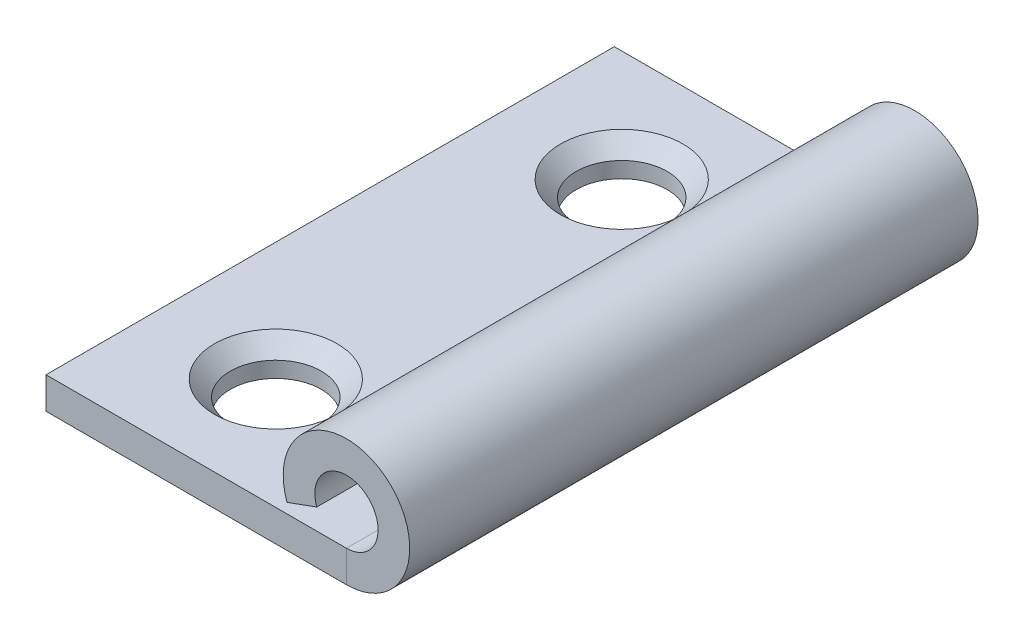
ISO-10303-21;
HEADER;
FILE_DESCRIPTION(('STEP AP214'),'2;1');
FILE_NAME('part.step','',(''),(''),'','','');
FILE_SCHEMA(('AUTOMOTIVE_DESIGN { 1 0 10303 214 1 1 1 1 }'));
ENDSEC;
DATA;
#1=APPLICATION_CONTEXT('core data for automotive mechanical design processes');
#2=APPLICATION_PROTOCOL_DEFINITION('international standard','automotive_design',2000,#1);
#3=PRODUCT_CONTEXT('',#1,'mechanical');
#4=PRODUCT('Part','Part','',(#3));
#5=PRODUCT_RELATED_PRODUCT_CATEGORY('part','',(#4));
#6=PRODUCT_DEFINITION_FORMATION('','',#4);
#7=PRODUCT_DEFINITION_CONTEXT('part definition',#1,'design');
#8=PRODUCT_DEFINITION('design','',#6,#7);
#9=PRODUCT_DEFINITION_SHAPE('','',#8);
#10=(LENGTH_UNIT() NAMED_UNIT(*) SI_UNIT(.MILLI.,.METRE.));
#11=(NAMED_UNIT(*) PLANE_ANGLE_UNIT() SI_UNIT($,.RADIAN.));
#12=(NAMED_UNIT(*) SI_UNIT($,.STERADIAN.) SOLID_ANGLE_UNIT());
#13=UNCERTAINTY_MEASURE_WITH_UNIT(LENGTH_MEASURE(1.E-05),#10,'distance_accuracy_value','');
#14=(GEOMETRIC_REPRESENTATION_CONTEXT(3) GLOBAL_UNCERTAINTY_ASSIGNED_CONTEXT((#13)) GLOBAL_UNIT_ASSIGNED_CONTEXT((#10,
#11,#12)) REPRESENTATION_CONTEXT('',''));
#15=CARTESIAN_POINT('',(0.,0.,0.));
#16=DIRECTION('',(0.,0.,1.));
#17=DIRECTION('',(1.,0.,0.));
#18=AXIS2_PLACEMENT_3D('',#15,#16,#17);
#19=CARTESIAN_POINT('',(0.,2.032,0.));
#20=DIRECTION('',(0.,1.,0.));
#21=DIRECTION('',(0.,0.,1.));
#22=AXIS2_PLACEMENT_3D('',#19,#20,#21);
#23=PLANE('',#22);
#24=CARTESIAN_POINT('',(-4.064,2.032,-11.1125));
#25=DIRECTION('',(0.,1.,0.));
#26=DIRECTION('',(0.,0.,1.));
#27=AXIS2_PLACEMENT_3D('',#24,#25,#26);
#28=CIRCLE('',#27,3.93700000000001);
#29=CARTESIAN_POINT('',(-4.064,2.032,-7.17549999999999));
#30=VERTEX_POINT('',#29);
#31=EDGE_CURVE('E59',#30,#30,#28,.F.);
#32=ORIENTED_EDGE('',*,*,#31,.T.);
#33=EDGE_LOOP('',(#32));
#34=FACE_BOUND('',#33,.T.);
#35=CARTESIAN_POINT('',(-4.064,2.032,11.1125));
#36=DIRECTION('',(0.,1.,0.));
#37=DIRECTION('',(0.,0.,1.));
#38=AXIS2_PLACEMENT_3D('',#35,#36,#37);
#39=CIRCLE('',#38,3.937);
#40=CARTESIAN_POINT('',(-4.064,2.032,15.0495));
#41=VERTEX_POINT('',#40);
#42=EDGE_CURVE('E124',#41,#41,#39,.F.);
#43=ORIENTED_EDGE('',*,*,#42,.T.);
#44=EDGE_LOOP('',(#43));
#45=FACE_BOUND('',#44,.T.);
#46=DIRECTION('',(0.,0.,-1.));
#47=VECTOR('',#46,1.);
#48=CARTESIAN_POINT('',(7.62,2.032,-18.25625));
#49=LINE('',#48,#47);
#50=CARTESIAN_POINT('',(7.62,2.032,-18.25625));
#51=VERTEX_POINT('',#50);
#52=CARTESIAN_POINT('',(7.62,2.032,18.25625));
#53=VERTEX_POINT('',#52);
#54=EDGE_CURVE('E199',#51,#53,#49,.F.);
#55=ORIENTED_EDGE('',*,*,#54,.F.);
#56=DIRECTION('',(-1.,0.,0.));
#57=VECTOR('',#56,1.);
#58=CARTESIAN_POINT('',(-11.684,2.032,-18.25625));
#59=LINE('',#58,#57);
#60=CARTESIAN_POINT('',(-11.684,2.032,-18.25625));
#61=VERTEX_POINT('',#60);
#62=EDGE_CURVE('E109',#51,#61,#59,.T.);
#63=ORIENTED_EDGE('',*,*,#62,.T.);
#64=DIRECTION('',(0.,0.,1.));
#65=VECTOR('',#64,1.);
#66=CARTESIAN_POINT('',(-11.684,2.032,-18.25625));
#67=LINE('',#66,#65);
#68=CARTESIAN_POINT('',(-11.684,2.032,18.25625));
#69=VERTEX_POINT('',#68);
#70=EDGE_CURVE('E71',#61,#69,#67,.T.);
#71=ORIENTED_EDGE('',*,*,#70,.T.);
#72=DIRECTION('',(1.,0.,0.));
#73=VECTOR('',#72,1.);
#74=CARTESIAN_POINT('',(-11.684,2.032,18.25625));
#75=LINE('',#74,#73);
#76=EDGE_CURVE('E105',#69,#53,#75,.T.);
#77=ORIENTED_EDGE('',*,*,#76,.T.);
#78=EDGE_LOOP('',(#55,#63,#71,#77));
#79=FACE_BOUND('',#78,.T.);
#80=ADVANCED_FACE('F48',(#34,#45,#79),#23,.T.);
#81=CARTESIAN_POINT('',(0.,0.,0.));
#82=DIRECTION('',(0.,1.,0.));
#83=DIRECTION('',(0.,0.,1.));
#84=AXIS2_PLACEMENT_3D('',#81,#82,#83);
#85=PLANE('',#84);
#86=DIRECTION('',(-1.,0.,0.));
#87=VECTOR('',#86,1.);
#88=CARTESIAN_POINT('',(-11.684,0.,-18.25625));
#89=LINE('',#88,#87);
#90=CARTESIAN_POINT('',(7.62,0.,-18.25625));
#91=VERTEX_POINT('',#90);
#92=CARTESIAN_POINT('',(-11.684,0.,-18.25625));
#93=VERTEX_POINT('',#92);
#94=EDGE_CURVE('E100',#91,#93,#89,.T.);
#95=ORIENTED_EDGE('',*,*,#94,.F.);
#96=DIRECTION('',(0.,0.,-1.));
#97=VECTOR('',#96,1.);
#98=CARTESIAN_POINT('',(7.62,0.,-18.25625));
#99=LINE('',#98,#97);
#100=CARTESIAN_POINT('',(7.62,0.,18.25625));
#101=VERTEX_POINT('',#100);
#102=EDGE_CURVE('E107',#91,#101,#99,.F.);
#103=ORIENTED_EDGE('',*,*,#102,.T.);
#104=DIRECTION('',(1.,0.,0.));
#105=VECTOR('',#104,1.);
#106=CARTESIAN_POINT('',(-11.684,0.,18.25625));
#107=LINE('',#106,#105);
#108=CARTESIAN_POINT('',(-11.684,0.,18.25625));
#109=VERTEX_POINT('',#108);
#110=EDGE_CURVE('E96',#109,#101,#107,.T.);
#111=ORIENTED_EDGE('',*,*,#110,.F.);
#112=DIRECTION('',(0.,0.,1.));
#113=VECTOR('',#112,1.);
#114=CARTESIAN_POINT('',(-11.684,0.,-18.25625));
#115=LINE('',#114,#113);
#116=EDGE_CURVE('E88',#93,#109,#115,.T.);
#117=ORIENTED_EDGE('',*,*,#116,.F.);
#118=EDGE_LOOP('',(#95,#103,#111,#117));
#119=FACE_BOUND('',#118,.T.);
#120=CARTESIAN_POINT('',(-4.064,0.,11.1125));
#121=DIRECTION('',(0.,1.,0.));
#122=DIRECTION('',(0.,0.,1.));
#123=AXIS2_PLACEMENT_3D('',#120,#121,#122);
#124=CIRCLE('',#123,2.921);
#125=CARTESIAN_POINT('',(-4.064,0.,14.0335));
#126=VERTEX_POINT('',#125);
#127=EDGE_CURVE('E146',#126,#126,#124,.T.);
#128=ORIENTED_EDGE('',*,*,#127,.T.);
#129=EDGE_LOOP('',(#128));
#130=FACE_BOUND('',#129,.T.);
#131=CARTESIAN_POINT('',(-4.064,0.,-11.1125));
#132=DIRECTION('',(0.,1.,0.));
#133=DIRECTION('',(0.,0.,1.));
#134=AXIS2_PLACEMENT_3D('',#131,#132,#133);
#135=CIRCLE('',#134,2.921);
#136=CARTESIAN_POINT('',(-4.064,0.,-8.1915));
#137=VERTEX_POINT('',#136);
#138=EDGE_CURVE('E144',#137,#137,#135,.T.);
#139=ORIENTED_EDGE('',*,*,#138,.T.);
#140=EDGE_LOOP('',(#139));
#141=FACE_BOUND('',#140,.T.);
#142=ADVANCED_FACE('F104',(#119,#130,#141),#85,.F.);
#143=CARTESIAN_POINT('',(-11.684,2.032,-18.25625));
#144=DIRECTION('',(0.,0.,1.));
#145=DIRECTION('',(1.,0.,0.));
#146=AXIS2_PLACEMENT_3D('',#143,#144,#145);
#147=PLANE('',#146);
#148=ORIENTED_EDGE('',*,*,#62,.F.);
#149=DIRECTION('',(0.,-1.,0.));
#150=VECTOR('',#149,1.);
#151=CARTESIAN_POINT('',(7.62,2.032,-18.25625));
#152=LINE('',#151,#150);
#153=EDGE_CURVE('E157',#51,#91,#152,.T.);
#154=ORIENTED_EDGE('',*,*,#153,.T.);
#155=ORIENTED_EDGE('',*,*,#94,.T.);
#156=DIRECTION('',(0.,-1.,0.));
#157=VECTOR('',#156,1.);
#158=CARTESIAN_POINT('',(-11.684,2.032,-18.25625));
#159=LINE('',#158,#157);
#160=EDGE_CURVE('E93',#61,#93,#159,.T.);
#161=ORIENTED_EDGE('',*,*,#160,.F.);
#162=EDGE_LOOP('',(#148,#154,#155,#161));
#163=FACE_BOUND('',#162,.T.);
#164=ADVANCED_FACE('F169',(#163),#147,.F.);
#165=CARTESIAN_POINT('',(-11.684,2.032,-18.25625));
#166=DIRECTION('',(1.,0.,0.));
#167=DIRECTION('',(0.,0.,-1.));
#168=AXIS2_PLACEMENT_3D('',#165,#166,#167);
#169=PLANE('',#168);
#170=ORIENTED_EDGE('',*,*,#116,.T.);
#171=DIRECTION('',(0.,-1.,0.));
#172=VECTOR('',#171,1.);
#173=CARTESIAN_POINT('',(-11.684,2.032,18.25625));
#174=LINE('',#173,#172);
#175=EDGE_CURVE('E90',#69,#109,#174,.T.);
#176=ORIENTED_EDGE('',*,*,#175,.F.);
#177=ORIENTED_EDGE('',*,*,#70,.F.);
#178=ORIENTED_EDGE('',*,*,#160,.T.);
#179=EDGE_LOOP('',(#170,#176,#177,#178));
#180=FACE_BOUND('',#179,.T.);
#181=ADVANCED_FACE('F86',(#180),#169,.F.);
#182=CARTESIAN_POINT('',(-11.684,2.032,18.25625));
#183=DIRECTION('',(0.,0.,-1.));
#184=DIRECTION('',(-1.,0.,0.));
#185=AXIS2_PLACEMENT_3D('',#182,#183,#184);
#186=PLANE('',#185);
#187=ORIENTED_EDGE('',*,*,#110,.T.);
#188=DIRECTION('',(0.,-1.,0.));
#189=VECTOR('',#188,1.);
#190=CARTESIAN_POINT('',(7.62,2.032,18.25625));
#191=LINE('',#190,#189);
#192=EDGE_CURVE('E61',#53,#101,#191,.T.);
#193=ORIENTED_EDGE('',*,*,#192,.F.);
#194=ORIENTED_EDGE('',*,*,#76,.F.);
#195=ORIENTED_EDGE('',*,*,#175,.T.);
#196=EDGE_LOOP('',(#187,#193,#194,#195));
#197=FACE_BOUND('',#196,.T.);
#198=ADVANCED_FACE('F97',(#197),#186,.F.);
#199=CARTESIAN_POINT('',(-4.064,2.032,11.1125));
#200=DIRECTION('',(0.,-1.,0.));
#201=DIRECTION('',(0.,0.,-1.));
#202=AXIS2_PLACEMENT_3D('',#199,#200,#201);
#203=CYLINDRICAL_SURFACE('',#202,2.921);
#204=CARTESIAN_POINT('',(-4.064,1.016,11.1125));
#205=DIRECTION('',(0.,1.,0.));
#206=DIRECTION('',(0.,0.,1.));
#207=AXIS2_PLACEMENT_3D('',#204,#205,#206);
#208=CIRCLE('',#207,2.921);
#209=CARTESIAN_POINT('',(-4.064,1.016,14.0335));
#210=VERTEX_POINT('',#209);
#211=EDGE_CURVE('E11',#210,#210,#208,.T.);
#212=ORIENTED_EDGE('',*,*,#211,.T.);
#213=EDGE_LOOP('',(#212));
#214=FACE_BOUND('',#213,.T.);
#215=ORIENTED_EDGE('',*,*,#127,.F.);
#216=EDGE_LOOP('',(#215));
#217=FACE_BOUND('',#216,.T.);
#218=ADVANCED_FACE('F143',(#214,#217),#203,.F.);
#219=CARTESIAN_POINT('',(-4.064,2.032,-11.1125));
#220=DIRECTION('',(0.,-1.,0.));
#221=DIRECTION('',(0.,0.,-1.));
#222=AXIS2_PLACEMENT_3D('',#219,#220,#221);
#223=CYLINDRICAL_SURFACE('',#222,2.921);
#224=CARTESIAN_POINT('',(-4.064,1.01599999999999,-11.1125));
#225=DIRECTION('',(0.,1.,0.));
#226=DIRECTION('',(0.,0.,1.));
#227=AXIS2_PLACEMENT_3D('',#224,#225,#226);
#228=CIRCLE('',#227,2.921);
#229=CARTESIAN_POINT('',(-4.064,1.01599999999999,-8.1915));
#230=VERTEX_POINT('',#229);
#231=EDGE_CURVE('E117',#230,#230,#228,.T.);
#232=ORIENTED_EDGE('',*,*,#231,.T.);
#233=EDGE_LOOP('',(#232));
#234=FACE_BOUND('',#233,.T.);
#235=ORIENTED_EDGE('',*,*,#138,.F.);
#236=EDGE_LOOP('',(#235));
#237=FACE_BOUND('',#236,.T.);
#238=ADVANCED_FACE('F140',(#234,#237),#223,.F.);
#239=CARTESIAN_POINT('',(5.71054459456304,3.36901506876221,0.));
#240=DIRECTION('',(-0.342020143325683,0.939692620785903,0.));
#241=DIRECTION('',(0.,0.,-1.));
#242=AXIS2_PLACEMENT_3D('',#239,#240,#241);
#243=PLANE('',#242);
#244=DIRECTION('',(-0.939692620785903,-0.342020143325683,0.));
#245=VECTOR('',#244,1.);
#246=CARTESIAN_POINT('',(5.71054459456304,3.36901506876221,-18.25625));
#247=LINE('',#246,#245);
#248=CARTESIAN_POINT('',(5.71054459456304,3.36901506876221,-18.25625));
#249=VERTEX_POINT('',#248);
#250=CARTESIAN_POINT('',(3.80108918912609,2.67403013752443,-18.25625));
#251=VERTEX_POINT('',#250);
#252=EDGE_CURVE('E149',#249,#251,#247,.T.);
#253=ORIENTED_EDGE('',*,*,#252,.F.);
#254=DIRECTION('',(0.,0.,-1.));
#255=VECTOR('',#254,1.);
#256=CARTESIAN_POINT('',(5.71054459456304,3.36901506876221,-18.25625));
#257=LINE('',#256,#255);
#258=CARTESIAN_POINT('',(5.71054459456304,3.36901506876221,18.25625));
#259=VERTEX_POINT('',#258);
#260=EDGE_CURVE('E210',#259,#249,#257,.T.);
#261=ORIENTED_EDGE('',*,*,#260,.F.);
#262=DIRECTION('',(-0.939692620785903,-0.342020143325683,0.));
#263=VECTOR('',#262,1.);
#264=CARTESIAN_POINT('',(5.71054459456304,3.36901506876221,18.25625));
#265=LINE('',#264,#263);
#266=CARTESIAN_POINT('',(3.80108918912609,2.67403013752443,18.25625));
#267=VERTEX_POINT('',#266);
#268=EDGE_CURVE('E156',#259,#267,#265,.T.);
#269=ORIENTED_EDGE('',*,*,#268,.T.);
#270=DIRECTION('',(0.,0.,-1.));
#271=VECTOR('',#270,1.);
#272=CARTESIAN_POINT('',(3.80108918912609,2.67403013752443,-18.25625));
#273=LINE('',#272,#271);
#274=EDGE_CURVE('E189',#267,#251,#273,.T.);
#275=ORIENTED_EDGE('',*,*,#274,.T.);
#276=EDGE_LOOP('',(#253,#261,#269,#275));
#277=FACE_BOUND('',#276,.T.);
#278=ADVANCED_FACE('F137',(#277),#243,.F.);
#279=CARTESIAN_POINT('',(7.62,4.064,18.25625));
#280=DIRECTION('',(0.,0.,1.));
#281=DIRECTION('',(1.,0.,0.));
#282=AXIS2_PLACEMENT_3D('',#279,#280,#281);
#283=PLANE('',#282);
#284=ORIENTED_EDGE('',*,*,#268,.F.);
#285=CARTESIAN_POINT('',(7.62,4.064,18.25625));
#286=DIRECTION('',(0.,0.,-1.));
#287=DIRECTION('',(-1.,0.,0.));
#288=AXIS2_PLACEMENT_3D('',#285,#286,#287);
#289=CIRCLE('',#288,2.032);
#290=EDGE_CURVE('E191',#53,#259,#289,.F.);
#291=ORIENTED_EDGE('',*,*,#290,.F.);
#292=ORIENTED_EDGE('',*,*,#192,.T.);
#293=CARTESIAN_POINT('',(7.62,4.064,18.25625));
#294=DIRECTION('',(0.,0.,-1.));
#295=DIRECTION('',(-1.,0.,0.));
#296=AXIS2_PLACEMENT_3D('',#293,#294,#295);
#297=CIRCLE('',#296,4.064);
#298=EDGE_CURVE('E182',#101,#267,#297,.F.);
#299=ORIENTED_EDGE('',*,*,#298,.T.);
#300=EDGE_LOOP('',(#284,#291,#292,#299));
#301=FACE_BOUND('',#300,.T.);
#302=ADVANCED_FACE('F221',(#301),#283,.T.);
#303=CARTESIAN_POINT('',(7.62,4.064,-18.25625));
#304=DIRECTION('',(0.,0.,1.));
#305=DIRECTION('',(1.,0.,0.));
#306=AXIS2_PLACEMENT_3D('',#303,#304,#305);
#307=PLANE('',#306);
#308=CARTESIAN_POINT('',(7.62,4.064,-18.25625));
#309=DIRECTION('',(0.,0.,-1.));
#310=DIRECTION('',(-1.,0.,0.));
#311=AXIS2_PLACEMENT_3D('',#308,#309,#310);
#312=CIRCLE('',#311,2.032);
#313=EDGE_CURVE('E204',#249,#51,#312,.T.);
#314=ORIENTED_EDGE('',*,*,#313,.F.);
#315=ORIENTED_EDGE('',*,*,#252,.T.);
#316=CARTESIAN_POINT('',(7.62,4.064,-18.25625));
#317=DIRECTION('',(0.,0.,-1.));
#318=DIRECTION('',(-1.,0.,0.));
#319=AXIS2_PLACEMENT_3D('',#316,#317,#318);
#320=CIRCLE('',#319,4.064);
#321=EDGE_CURVE('E177',#251,#91,#320,.T.);
#322=ORIENTED_EDGE('',*,*,#321,.T.);
#323=ORIENTED_EDGE('',*,*,#153,.F.);
#324=EDGE_LOOP('',(#314,#315,#322,#323));
#325=FACE_BOUND('',#324,.T.);
#326=ADVANCED_FACE('F186',(#325),#307,.F.);
#327=CARTESIAN_POINT('',(7.62,4.064,-18.25625));
#328=DIRECTION('',(0.,0.,-1.));
#329=DIRECTION('',(-0.939692620785903,-0.342020143325683,0.));
#330=AXIS2_PLACEMENT_3D('',#327,#328,#329);
#331=CYLINDRICAL_SURFACE('',#330,4.064);
#332=ORIENTED_EDGE('',*,*,#102,.F.);
#333=ORIENTED_EDGE('',*,*,#321,.F.);
#334=ORIENTED_EDGE('',*,*,#274,.F.);
#335=ORIENTED_EDGE('',*,*,#298,.F.);
#336=EDGE_LOOP('',(#332,#333,#334,#335));
#337=FACE_BOUND('',#336,.T.);
#338=ADVANCED_FACE('F171',(#337),#331,.T.);
#339=CARTESIAN_POINT('',(7.62,4.064,-18.25625));
#340=DIRECTION('',(0.,0.,-1.));
#341=DIRECTION('',(-0.939692620785903,-0.342020143325683,0.));
#342=AXIS2_PLACEMENT_3D('',#339,#340,#341);
#343=CYLINDRICAL_SURFACE('',#342,2.032);
#344=ORIENTED_EDGE('',*,*,#54,.T.);
#345=ORIENTED_EDGE('',*,*,#290,.T.);
#346=ORIENTED_EDGE('',*,*,#260,.T.);
#347=ORIENTED_EDGE('',*,*,#313,.T.);
#348=EDGE_LOOP('',(#344,#345,#346,#347));
#349=FACE_BOUND('',#348,.T.);
#350=ADVANCED_FACE('F133',(#349),#343,.F.);
#351=CARTESIAN_POINT('',(-4.064,1.01599999999999,-11.1125));
#352=DIRECTION('',(0.,1.,0.));
#353=DIRECTION('',(0.,0.,1.));
#354=AXIS2_PLACEMENT_3D('',#351,#352,#353);
#355=CONICAL_SURFACE('',#354,2.921,0.785398163397452);
#356=ORIENTED_EDGE('',*,*,#31,.F.);
#357=EDGE_LOOP('',(#356));
#358=FACE_BOUND('',#357,.T.);
#359=ORIENTED_EDGE('',*,*,#231,.F.);
#360=EDGE_LOOP('',(#359));
#361=FACE_BOUND('',#360,.T.);
#362=ADVANCED_FACE('F131',(#358,#361),#355,.F.);
#363=CARTESIAN_POINT('',(-4.064,1.016,11.1125));
#364=DIRECTION('',(0.,1.,0.));
#365=DIRECTION('',(0.,0.,1.));
#366=AXIS2_PLACEMENT_3D('',#363,#364,#365);
#367=CONICAL_SURFACE('',#366,2.921,0.785398163397449);
#368=ORIENTED_EDGE('',*,*,#42,.F.);
#369=EDGE_LOOP('',(#368));
#370=FACE_BOUND('',#369,.T.);
#371=ORIENTED_EDGE('',*,*,#211,.F.);
#372=EDGE_LOOP('',(#371));
#373=FACE_BOUND('',#372,.T.);
#374=ADVANCED_FACE('F51',(#370,#373),#367,.F.);
#375=CLOSED_SHELL('',(#80,#142,#164,#181,#198,#218,#238,#278,#302,#326,#338,#350,#362,#374));
#376=MANIFOLD_SOLID_BREP('B2',#375);
#377=ADVANCED_BREP_SHAPE_REPRESENTATION('',(#18,#376),#14);
#378=SHAPE_DEFINITION_REPRESENTATION(#9,#377);
ENDSEC;
END-ISO-10303-21;
